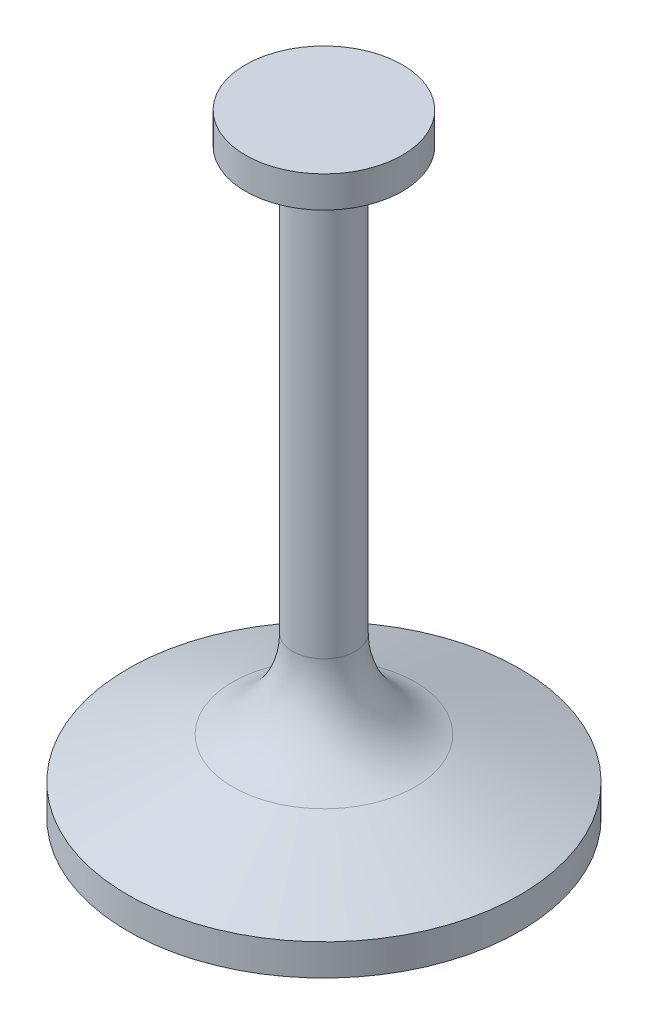
ISO-10303-21;
HEADER;
FILE_DESCRIPTION(('STEP AP214'),'2;1');
FILE_NAME('part.step','',(''),(''),'','','');
FILE_SCHEMA(('AUTOMOTIVE_DESIGN { 1 0 10303 214 1 1 1 1 }'));
ENDSEC;
DATA;
#1=APPLICATION_CONTEXT('core data for automotive mechanical design processes');
#2=APPLICATION_PROTOCOL_DEFINITION('international standard','automotive_design',2000,#1);
#3=PRODUCT_CONTEXT('',#1,'mechanical');
#4=PRODUCT('Part','Part','',(#3));
#5=PRODUCT_RELATED_PRODUCT_CATEGORY('part','',(#4));
#6=PRODUCT_DEFINITION_FORMATION('','',#4);
#7=PRODUCT_DEFINITION_CONTEXT('part definition',#1,'design');
#8=PRODUCT_DEFINITION('design','',#6,#7);
#9=PRODUCT_DEFINITION_SHAPE('','',#8);
#10=(LENGTH_UNIT() NAMED_UNIT(*) SI_UNIT(.MILLI.,.METRE.));
#11=(NAMED_UNIT(*) PLANE_ANGLE_UNIT() SI_UNIT($,.RADIAN.));
#12=(NAMED_UNIT(*) SI_UNIT($,.STERADIAN.) SOLID_ANGLE_UNIT());
#13=UNCERTAINTY_MEASURE_WITH_UNIT(LENGTH_MEASURE(1.E-05),#10,'distance_accuracy_value','');
#14=(GEOMETRIC_REPRESENTATION_CONTEXT(3) GLOBAL_UNCERTAINTY_ASSIGNED_CONTEXT((#13)) GLOBAL_UNIT_ASSIGNED_CONTEXT((#10,
#11,#12)) REPRESENTATION_CONTEXT('',''));
#15=CARTESIAN_POINT('',(0.,0.,0.));
#16=DIRECTION('',(0.,0.,1.));
#17=DIRECTION('',(1.,0.,0.));
#18=AXIS2_PLACEMENT_3D('',#15,#16,#17);
#19=CARTESIAN_POINT('',(0.,990.6,0.));
#20=DIRECTION('',(0.,1.,0.));
#21=DIRECTION('',(0.,0.,1.));
#22=AXIS2_PLACEMENT_3D('',#19,#20,#21);
#23=PLANE('',#22);
#24=CARTESIAN_POINT('',(0.,990.6,0.));
#25=DIRECTION('',(0.,-1.,0.));
#26=DIRECTION('',(0.,0.,-1.));
#27=AXIS2_PLACEMENT_3D('',#24,#25,#26);
#28=CIRCLE('',#27,127.);
#29=CARTESIAN_POINT('',(0.,990.6,-127.));
#30=VERTEX_POINT('',#29);
#31=EDGE_CURVE('E116',#30,#30,#28,.T.);
#32=ORIENTED_EDGE('',*,*,#31,.F.);
#33=EDGE_LOOP('',(#32));
#34=FACE_BOUND('',#33,.T.);
#35=ADVANCED_FACE('F44',(#34),#23,.T.);
#36=CARTESIAN_POINT('',(0.,96.4658245005163,0.));
#37=DIRECTION('',(0.,-1.,0.));
#38=DIRECTION('',(0.,0.,-1.));
#39=AXIS2_PLACEMENT_3D('',#36,#37,#38);
#40=CYLINDRICAL_SURFACE('',#39,127.);
#41=ORIENTED_EDGE('',*,*,#31,.T.);
#42=EDGE_LOOP('',(#41));
#43=FACE_BOUND('',#42,.T.);
#44=CARTESIAN_POINT('',(0.,939.8,0.));
#45=DIRECTION('',(0.,-1.,0.));
#46=DIRECTION('',(0.,0.,-1.));
#47=AXIS2_PLACEMENT_3D('',#44,#45,#46);
#48=CIRCLE('',#47,127.);
#49=CARTESIAN_POINT('',(0.,939.8,-127.));
#50=VERTEX_POINT('',#49);
#51=EDGE_CURVE('E113',#50,#50,#48,.T.);
#52=ORIENTED_EDGE('',*,*,#51,.F.);
#53=EDGE_LOOP('',(#52));
#54=FACE_BOUND('',#53,.T.);
#55=ADVANCED_FACE('F75',(#43,#54),#40,.T.);
#56=CARTESIAN_POINT('',(127.,939.8,0.));
#57=DIRECTION('',(0.,-1.,0.));
#58=DIRECTION('',(0.,0.,-1.));
#59=AXIS2_PLACEMENT_3D('',#56,#57,#58);
#60=PLANE('',#59);
#61=ORIENTED_EDGE('',*,*,#51,.T.);
#62=EDGE_LOOP('',(#61));
#63=FACE_BOUND('',#62,.T.);
#64=CARTESIAN_POINT('',(0.,939.8,0.));
#65=DIRECTION('',(0.,-1.,0.));
#66=DIRECTION('',(0.,0.,-1.));
#67=AXIS2_PLACEMENT_3D('',#64,#65,#66);
#68=CIRCLE('',#67,50.8);
#69=CARTESIAN_POINT('',(0.,939.8,-50.8));
#70=VERTEX_POINT('',#69);
#71=EDGE_CURVE('E107',#70,#70,#68,.T.);
#72=ORIENTED_EDGE('',*,*,#71,.F.);
#73=EDGE_LOOP('',(#72));
#74=FACE_BOUND('',#73,.T.);
#75=ADVANCED_FACE('F80',(#63,#74),#60,.T.);
#76=CARTESIAN_POINT('',(0.,96.4658245005163,0.));
#77=DIRECTION('',(0.,-1.,0.));
#78=DIRECTION('',(0.,0.,-1.));
#79=AXIS2_PLACEMENT_3D('',#76,#77,#78);
#80=CYLINDRICAL_SURFACE('',#79,50.8);
#81=CARTESIAN_POINT('',(0.,256.384941896115,0.));
#82=DIRECTION('',(0.,-1.,0.));
#83=DIRECTION('',(0.,0.,-1.));
#84=AXIS2_PLACEMENT_3D('',#81,#82,#83);
#85=CIRCLE('',#84,50.8);
#86=CARTESIAN_POINT('',(0.,256.384941896115,-50.8));
#87=VERTEX_POINT('',#86);
#88=EDGE_CURVE('E11',#87,#87,#85,.F.);
#89=ORIENTED_EDGE('',*,*,#88,.T.);
#90=EDGE_LOOP('',(#89));
#91=FACE_BOUND('',#90,.T.);
#92=ORIENTED_EDGE('',*,*,#71,.T.);
#93=EDGE_LOOP('',(#92));
#94=FACE_BOUND('',#93,.T.);
#95=ADVANCED_FACE('F83',(#91,#94),#80,.T.);
#96=CARTESIAN_POINT('',(0.,47.9494884311733,0.));
#97=DIRECTION('',(0.,-1.,0.));
#98=DIRECTION('',(0.,0.,-1.));
#99=AXIS2_PLACEMENT_3D('',#96,#97,#98);
#100=CONICAL_SURFACE('',#99,317.5,1.19751715447671);
#101=CARTESIAN_POINT('',(0.,114.479733843724,0.));
#102=DIRECTION('',(0.,-1.,0.));
#103=DIRECTION('',(0.,0.,-1.));
#104=AXIS2_PLACEMENT_3D('',#101,#102,#103);
#105=CIRCLE('',#104,147.624178570105);
#106=CARTESIAN_POINT('',(0.,114.479733843724,-147.624178570105));
#107=VERTEX_POINT('',#106);
#108=EDGE_CURVE('E52',#107,#107,#105,.T.);
#109=ORIENTED_EDGE('',*,*,#108,.T.);
#110=EDGE_LOOP('',(#109));
#111=FACE_BOUND('',#110,.T.);
#112=CARTESIAN_POINT('',(0.,47.9494884311733,0.));
#113=DIRECTION('',(0.,-1.,0.));
#114=DIRECTION('',(0.,0.,-1.));
#115=AXIS2_PLACEMENT_3D('',#112,#113,#114);
#116=CIRCLE('',#115,317.5);
#117=CARTESIAN_POINT('',(0.,47.9494884311733,-317.5));
#118=VERTEX_POINT('',#117);
#119=EDGE_CURVE('E97',#118,#118,#116,.T.);
#120=ORIENTED_EDGE('',*,*,#119,.F.);
#121=EDGE_LOOP('',(#120));
#122=FACE_BOUND('',#121,.T.);
#123=ADVANCED_FACE('F87',(#111,#122),#100,.T.);
#124=CARTESIAN_POINT('',(0.,96.4658245005163,0.));
#125=DIRECTION('',(0.,-1.,0.));
#126=DIRECTION('',(0.,0.,-1.));
#127=AXIS2_PLACEMENT_3D('',#124,#125,#126);
#128=CYLINDRICAL_SURFACE('',#127,317.5);
#129=ORIENTED_EDGE('',*,*,#119,.T.);
#130=EDGE_LOOP('',(#129));
#131=FACE_BOUND('',#130,.T.);
#132=CARTESIAN_POINT('',(0.,-2.85051156882668,0.));
#133=DIRECTION('',(0.,-1.,0.));
#134=DIRECTION('',(0.,0.,-1.));
#135=AXIS2_PLACEMENT_3D('',#132,#133,#134);
#136=CIRCLE('',#135,317.5);
#137=CARTESIAN_POINT('',(0.,-2.85051156882668,-317.5));
#138=VERTEX_POINT('',#137);
#139=EDGE_CURVE('E105',#138,#138,#136,.T.);
#140=ORIENTED_EDGE('',*,*,#139,.F.);
#141=EDGE_LOOP('',(#140));
#142=FACE_BOUND('',#141,.T.);
#143=ADVANCED_FACE('F70',(#131,#142),#128,.T.);
#144=CARTESIAN_POINT('',(317.5,-2.85051156882656,0.));
#145=DIRECTION('',(0.,-1.,0.));
#146=DIRECTION('',(0.,0.,-1.));
#147=AXIS2_PLACEMENT_3D('',#144,#145,#146);
#148=PLANE('',#147);
#149=ORIENTED_EDGE('',*,*,#139,.T.);
#150=EDGE_LOOP('',(#149));
#151=FACE_BOUND('',#150,.T.);
#152=CARTESIAN_POINT('',(0.,-2.85051156882643,0.));
#153=DIRECTION('',(0.,-1.,0.));
#154=DIRECTION('',(0.,0.,-1.));
#155=AXIS2_PLACEMENT_3D('',#152,#153,#154);
#156=CIRCLE('',#155,266.7);
#157=CARTESIAN_POINT('',(0.,-2.85051156882643,-266.7));
#158=VERTEX_POINT('',#157);
#159=EDGE_CURVE('E102',#158,#158,#156,.T.);
#160=ORIENTED_EDGE('',*,*,#159,.F.);
#161=EDGE_LOOP('',(#160));
#162=FACE_BOUND('',#161,.T.);
#163=ADVANCED_FACE('F59',(#151,#162),#148,.T.);
#164=CARTESIAN_POINT('',(0.,-1016.,262.428636620295));
#165=DIRECTION('',(-1.,0.,0.));
#166=DIRECTION('',(0.,0.,-1.));
#167=AXIS2_PLACEMENT_3D('',#164,#165,#166);
#168=CIRCLE('',#167,1143.);
#169=TRIMMED_CURVE('',#168,(PARAMETER_VALUE(-1.33913338562854)),
(PARAMETER_VALUE(1.33913338562854)),.T.,.PARAMETER.);
#170=CARTESIAN_POINT('',(0.,-1016.,0.));
#171=DIRECTION('',(0.,-1.,0.));
#172=AXIS1_PLACEMENT('',#170,#171);
#173=SURFACE_OF_REVOLUTION('',#169,#172);
#174=ORIENTED_EDGE('',*,*,#159,.T.);
#175=EDGE_LOOP('',(#174));
#176=FACE_BOUND('',#175,.T.);
#177=CARTESIAN_POINT('',(0.,96.4658245005163,0.));
#178=VERTEX_POINT('',#177);
#179=VERTEX_LOOP('',#178);
#180=FACE_BOUND('',#179,.T.);
#181=ADVANCED_FACE('F57',(#176,#180),#173,.F.);
#182=CARTESIAN_POINT('',(0.,256.384941896115,0.));
#183=DIRECTION('',(0.,-1.,0.));
#184=DIRECTION('',(0.,0.,-1.));
#185=AXIS2_PLACEMENT_3D('',#182,#183,#184);
#186=TOROIDAL_SURFACE('',#185,203.2,152.4);
#187=ORIENTED_EDGE('',*,*,#88,.F.);
#188=EDGE_LOOP('',(#187));
#189=FACE_BOUND('',#188,.T.);
#190=ORIENTED_EDGE('',*,*,#108,.F.);
#191=EDGE_LOOP('',(#190));
#192=FACE_BOUND('',#191,.T.);
#193=ADVANCED_FACE('F50',(#189,#192),#186,.F.);
#194=CLOSED_SHELL('',(#35,#55,#75,#95,#123,#143,#163,#181,#193));
#195=MANIFOLD_SOLID_BREP('B2',#194);
#196=ADVANCED_BREP_SHAPE_REPRESENTATION('',(#18,#195),#14);
#197=SHAPE_DEFINITION_REPRESENTATION(#9,#196);
ENDSEC;
END-ISO-10303-21;
